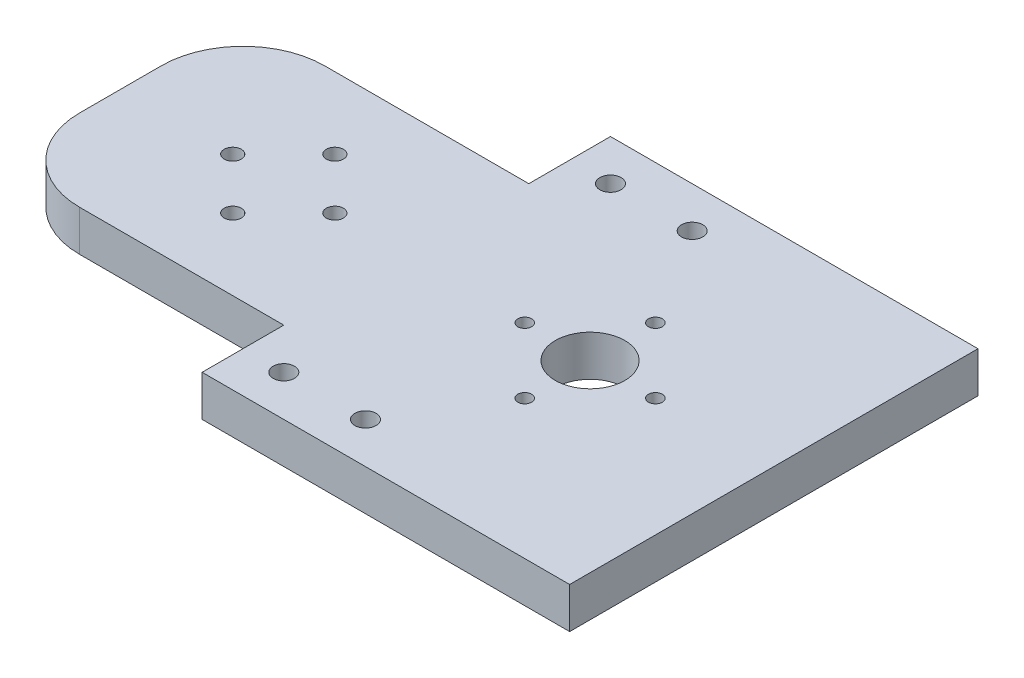
ISO-10303-21;
HEADER;
FILE_DESCRIPTION(('STEP AP214'),'2;1');
FILE_NAME('part.step','',(''),(''),'','','');
FILE_SCHEMA(('AUTOMOTIVE_DESIGN { 1 0 10303 214 1 1 1 1 }'));
ENDSEC;
DATA;
#1=APPLICATION_CONTEXT('core data for automotive mechanical design processes');
#2=APPLICATION_PROTOCOL_DEFINITION('international standard','automotive_design',2000,#1);
#3=PRODUCT_CONTEXT('',#1,'mechanical');
#4=PRODUCT('Part','Part','',(#3));
#5=PRODUCT_RELATED_PRODUCT_CATEGORY('part','',(#4));
#6=PRODUCT_DEFINITION_FORMATION('','',#4);
#7=PRODUCT_DEFINITION_CONTEXT('part definition',#1,'design');
#8=PRODUCT_DEFINITION('design','',#6,#7);
#9=PRODUCT_DEFINITION_SHAPE('','',#8);
#10=(LENGTH_UNIT() NAMED_UNIT(*) SI_UNIT(.MILLI.,.METRE.));
#11=(NAMED_UNIT(*) PLANE_ANGLE_UNIT() SI_UNIT($,.RADIAN.));
#12=(NAMED_UNIT(*) SI_UNIT($,.STERADIAN.) SOLID_ANGLE_UNIT());
#13=UNCERTAINTY_MEASURE_WITH_UNIT(LENGTH_MEASURE(1.E-05),#10,'distance_accuracy_value','');
#14=(GEOMETRIC_REPRESENTATION_CONTEXT(3) GLOBAL_UNCERTAINTY_ASSIGNED_CONTEXT((#13)) GLOBAL_UNIT_ASSIGNED_CONTEXT((#10,
#11,#12)) REPRESENTATION_CONTEXT('',''));
#15=CARTESIAN_POINT('',(0.,0.,0.));
#16=DIRECTION('',(0.,0.,1.));
#17=DIRECTION('',(1.,0.,0.));
#18=AXIS2_PLACEMENT_3D('',#15,#16,#17);
#19=CARTESIAN_POINT('',(-90.,10.,-50.));
#20=DIRECTION('',(0.,0.,1.));
#21=DIRECTION('',(1.,0.,0.));
#22=AXIS2_PLACEMENT_3D('',#19,#20,#21);
#23=PLANE('',#22);
#24=DIRECTION('',(-1.,0.,0.));
#25=VECTOR('',#24,1.);
#26=CARTESIAN_POINT('',(-90.,0.,-50.));
#27=LINE('',#26,#25);
#28=CARTESIAN_POINT('',(0.,0.,-50.));
#29=VERTEX_POINT('',#28);
#30=CARTESIAN_POINT('',(-90.,0.,-50.));
#31=VERTEX_POINT('',#30);
#32=EDGE_CURVE('E1217',#29,#31,#27,.T.);
#33=ORIENTED_EDGE('',*,*,#32,.T.);
#34=DIRECTION('',(0.,-1.,0.));
#35=VECTOR('',#34,1.);
#36=CARTESIAN_POINT('',(-90.,10.,-50.));
#37=LINE('',#36,#35);
#38=CARTESIAN_POINT('',(-90.,10.,-50.));
#39=VERTEX_POINT('',#38);
#40=EDGE_CURVE('E1199',#39,#31,#37,.T.);
#41=ORIENTED_EDGE('',*,*,#40,.F.);
#42=DIRECTION('',(-1.,0.,0.));
#43=VECTOR('',#42,1.);
#44=CARTESIAN_POINT('',(-90.,10.,-50.));
#45=LINE('',#44,#43);
#46=CARTESIAN_POINT('',(0.,10.,-50.));
#47=VERTEX_POINT('',#46);
#48=EDGE_CURVE('E1208',#47,#39,#45,.T.);
#49=ORIENTED_EDGE('',*,*,#48,.F.);
#50=DIRECTION('',(0.,-1.,0.));
#51=VECTOR('',#50,1.);
#52=CARTESIAN_POINT('',(0.,10.,-50.));
#53=LINE('',#52,#51);
#54=EDGE_CURVE('E1294',#47,#29,#53,.T.);
#55=ORIENTED_EDGE('',*,*,#54,.T.);
#56=EDGE_LOOP('',(#33,#41,#49,#55));
#57=FACE_BOUND('',#56,.T.);
#58=ADVANCED_FACE('F1112',(#57),#23,.F.);
#59=CARTESIAN_POINT('',(-90.,10.,-30.));
#60=DIRECTION('',(1.,0.,0.));
#61=DIRECTION('',(0.,0.,-1.));
#62=AXIS2_PLACEMENT_3D('',#59,#60,#61);
#63=PLANE('',#62);
#64=DIRECTION('',(0.,0.,1.));
#65=VECTOR('',#64,1.);
#66=CARTESIAN_POINT('',(-90.,0.,-30.));
#67=LINE('',#66,#65);
#68=CARTESIAN_POINT('',(-90.,0.,-30.));
#69=VERTEX_POINT('',#68);
#70=EDGE_CURVE('E1283',#31,#69,#67,.T.);
#71=ORIENTED_EDGE('',*,*,#70,.T.);
#72=DIRECTION('',(0.,-1.,0.));
#73=VECTOR('',#72,1.);
#74=CARTESIAN_POINT('',(-90.,10.,-30.));
#75=LINE('',#74,#73);
#76=CARTESIAN_POINT('',(-90.,10.,-30.));
#77=VERTEX_POINT('',#76);
#78=EDGE_CURVE('E1202',#77,#69,#75,.T.);
#79=ORIENTED_EDGE('',*,*,#78,.F.);
#80=DIRECTION('',(0.,0.,1.));
#81=VECTOR('',#80,1.);
#82=CARTESIAN_POINT('',(-90.,10.,-30.));
#83=LINE('',#82,#81);
#84=EDGE_CURVE('E1192',#39,#77,#83,.T.);
#85=ORIENTED_EDGE('',*,*,#84,.F.);
#86=ORIENTED_EDGE('',*,*,#40,.T.);
#87=EDGE_LOOP('',(#71,#79,#85,#86));
#88=FACE_BOUND('',#87,.T.);
#89=ADVANCED_FACE('F1200',(#88),#63,.F.);
#90=CARTESIAN_POINT('',(-160.,10.,-30.));
#91=DIRECTION('',(0.,0.,1.));
#92=DIRECTION('',(1.,0.,0.));
#93=AXIS2_PLACEMENT_3D('',#90,#91,#92);
#94=PLANE('',#93);
#95=DIRECTION('',(-1.,0.,0.));
#96=VECTOR('',#95,1.);
#97=CARTESIAN_POINT('',(-160.,0.,-30.));
#98=LINE('',#97,#96);
#99=CARTESIAN_POINT('',(-140.,0.,-30.));
#100=VERTEX_POINT('',#99);
#101=EDGE_CURVE('E1272',#69,#100,#98,.T.);
#102=ORIENTED_EDGE('',*,*,#101,.T.);
#103=DIRECTION('',(0.,-1.,0.));
#104=VECTOR('',#103,1.);
#105=CARTESIAN_POINT('',(-140.,10.,-30.));
#106=LINE('',#105,#104);
#107=CARTESIAN_POINT('',(-140.,10.,-30.));
#108=VERTEX_POINT('',#107);
#109=EDGE_CURVE('E12',#100,#108,#106,.F.);
#110=ORIENTED_EDGE('',*,*,#109,.T.);
#111=DIRECTION('',(-1.,0.,0.));
#112=VECTOR('',#111,1.);
#113=CARTESIAN_POINT('',(-160.,10.,-30.));
#114=LINE('',#113,#112);
#115=EDGE_CURVE('E1204',#77,#108,#114,.T.);
#116=ORIENTED_EDGE('',*,*,#115,.F.);
#117=ORIENTED_EDGE('',*,*,#78,.T.);
#118=EDGE_LOOP('',(#102,#110,#116,#117));
#119=FACE_BOUND('',#118,.T.);
#120=ADVANCED_FACE('F1326',(#119),#94,.F.);
#121=CARTESIAN_POINT('',(-160.,10.,30.));
#122=DIRECTION('',(1.,0.,0.));
#123=DIRECTION('',(0.,0.,-1.));
#124=AXIS2_PLACEMENT_3D('',#121,#122,#123);
#125=PLANE('',#124);
#126=DIRECTION('',(0.,0.,1.));
#127=VECTOR('',#126,1.);
#128=CARTESIAN_POINT('',(-160.,0.,30.));
#129=LINE('',#128,#127);
#130=CARTESIAN_POINT('',(-160.,0.,-10.));
#131=VERTEX_POINT('',#130);
#132=CARTESIAN_POINT('',(-160.,0.,10.));
#133=VERTEX_POINT('',#132);
#134=EDGE_CURVE('E1270',#131,#133,#129,.T.);
#135=ORIENTED_EDGE('',*,*,#134,.T.);
#136=DIRECTION('',(0.,-1.,0.));
#137=VECTOR('',#136,1.);
#138=CARTESIAN_POINT('',(-160.,10.,10.));
#139=LINE('',#138,#137);
#140=CARTESIAN_POINT('',(-160.,10.,10.));
#141=VERTEX_POINT('',#140);
#142=EDGE_CURVE('E1137',#133,#141,#139,.F.);
#143=ORIENTED_EDGE('',*,*,#142,.T.);
#144=DIRECTION('',(0.,0.,1.));
#145=VECTOR('',#144,1.);
#146=CARTESIAN_POINT('',(-160.,10.,30.));
#147=LINE('',#146,#145);
#148=CARTESIAN_POINT('',(-160.,10.,-10.));
#149=VERTEX_POINT('',#148);
#150=EDGE_CURVE('E1251',#149,#141,#147,.T.);
#151=ORIENTED_EDGE('',*,*,#150,.F.);
#152=DIRECTION('',(0.,-1.,0.));
#153=VECTOR('',#152,1.);
#154=CARTESIAN_POINT('',(-160.,10.,-10.));
#155=LINE('',#154,#153);
#156=EDGE_CURVE('E1238',#149,#131,#155,.T.);
#157=ORIENTED_EDGE('',*,*,#156,.T.);
#158=EDGE_LOOP('',(#135,#143,#151,#157));
#159=FACE_BOUND('',#158,.T.);
#160=ADVANCED_FACE('F1275',(#159),#125,.F.);
#161=CARTESIAN_POINT('',(-90.,10.,30.));
#162=DIRECTION('',(0.,0.,-1.));
#163=DIRECTION('',(-1.,0.,0.));
#164=AXIS2_PLACEMENT_3D('',#161,#162,#163);
#165=PLANE('',#164);
#166=DIRECTION('',(1.,0.,0.));
#167=VECTOR('',#166,1.);
#168=CARTESIAN_POINT('',(-90.,10.,30.));
#169=LINE('',#168,#167);
#170=CARTESIAN_POINT('',(-140.,10.,30.));
#171=VERTEX_POINT('',#170);
#172=CARTESIAN_POINT('',(-90.,10.,30.));
#173=VERTEX_POINT('',#172);
#174=EDGE_CURVE('E1254',#171,#173,#169,.T.);
#175=ORIENTED_EDGE('',*,*,#174,.F.);
#176=DIRECTION('',(0.,-1.,0.));
#177=VECTOR('',#176,1.);
#178=CARTESIAN_POINT('',(-140.,10.,30.));
#179=LINE('',#178,#177);
#180=CARTESIAN_POINT('',(-140.,0.,30.));
#181=VERTEX_POINT('',#180);
#182=EDGE_CURVE('E1221',#171,#181,#179,.T.);
#183=ORIENTED_EDGE('',*,*,#182,.T.);
#184=DIRECTION('',(1.,0.,0.));
#185=VECTOR('',#184,1.);
#186=CARTESIAN_POINT('',(-90.,0.,30.));
#187=LINE('',#186,#185);
#188=CARTESIAN_POINT('',(-90.,0.,30.));
#189=VERTEX_POINT('',#188);
#190=EDGE_CURVE('E1273',#181,#189,#187,.T.);
#191=ORIENTED_EDGE('',*,*,#190,.T.);
#192=DIRECTION('',(0.,-1.,0.));
#193=VECTOR('',#192,1.);
#194=CARTESIAN_POINT('',(-90.,10.,30.));
#195=LINE('',#194,#193);
#196=EDGE_CURVE('E1228',#173,#189,#195,.T.);
#197=ORIENTED_EDGE('',*,*,#196,.F.);
#198=EDGE_LOOP('',(#175,#183,#191,#197));
#199=FACE_BOUND('',#198,.T.);
#200=ADVANCED_FACE('F1260',(#199),#165,.F.);
#201=CARTESIAN_POINT('',(-90.,10.,50.));
#202=DIRECTION('',(1.,0.,0.));
#203=DIRECTION('',(0.,0.,-1.));
#204=AXIS2_PLACEMENT_3D('',#201,#202,#203);
#205=PLANE('',#204);
#206=DIRECTION('',(0.,0.,1.));
#207=VECTOR('',#206,1.);
#208=CARTESIAN_POINT('',(-90.,0.,50.));
#209=LINE('',#208,#207);
#210=CARTESIAN_POINT('',(-90.,0.,50.));
#211=VERTEX_POINT('',#210);
#212=EDGE_CURVE('E1279',#189,#211,#209,.T.);
#213=ORIENTED_EDGE('',*,*,#212,.T.);
#214=DIRECTION('',(0.,-1.,0.));
#215=VECTOR('',#214,1.);
#216=CARTESIAN_POINT('',(-90.,10.,50.));
#217=LINE('',#216,#215);
#218=CARTESIAN_POINT('',(-90.,10.,50.));
#219=VERTEX_POINT('',#218);
#220=EDGE_CURVE('E1296',#219,#211,#217,.T.);
#221=ORIENTED_EDGE('',*,*,#220,.F.);
#222=DIRECTION('',(0.,0.,1.));
#223=VECTOR('',#222,1.);
#224=CARTESIAN_POINT('',(-90.,10.,50.));
#225=LINE('',#224,#223);
#226=EDGE_CURVE('E1261',#173,#219,#225,.T.);
#227=ORIENTED_EDGE('',*,*,#226,.F.);
#228=ORIENTED_EDGE('',*,*,#196,.T.);
#229=EDGE_LOOP('',(#213,#221,#227,#228));
#230=FACE_BOUND('',#229,.T.);
#231=ADVANCED_FACE('F1302',(#230),#205,.F.);
#232=CARTESIAN_POINT('',(0.,10.,50.));
#233=DIRECTION('',(0.,0.,-1.));
#234=DIRECTION('',(-1.,0.,0.));
#235=AXIS2_PLACEMENT_3D('',#232,#233,#234);
#236=PLANE('',#235);
#237=DIRECTION('',(1.,0.,0.));
#238=VECTOR('',#237,1.);
#239=CARTESIAN_POINT('',(0.,0.,50.));
#240=LINE('',#239,#238);
#241=CARTESIAN_POINT('',(0.,0.,50.));
#242=VERTEX_POINT('',#241);
#243=EDGE_CURVE('E1287',#211,#242,#240,.T.);
#244=ORIENTED_EDGE('',*,*,#243,.T.);
#245=DIRECTION('',(0.,-1.,0.));
#246=VECTOR('',#245,1.);
#247=CARTESIAN_POINT('',(0.,10.,50.));
#248=LINE('',#247,#246);
#249=CARTESIAN_POINT('',(0.,10.,50.));
#250=VERTEX_POINT('',#249);
#251=EDGE_CURVE('E1293',#250,#242,#248,.T.);
#252=ORIENTED_EDGE('',*,*,#251,.F.);
#253=DIRECTION('',(1.,0.,0.));
#254=VECTOR('',#253,1.);
#255=CARTESIAN_POINT('',(0.,10.,50.));
#256=LINE('',#255,#254);
#257=EDGE_CURVE('E1317',#219,#250,#256,.T.);
#258=ORIENTED_EDGE('',*,*,#257,.F.);
#259=ORIENTED_EDGE('',*,*,#220,.T.);
#260=EDGE_LOOP('',(#244,#252,#258,#259));
#261=FACE_BOUND('',#260,.T.);
#262=ADVANCED_FACE('F1312',(#261),#236,.F.);
#263=CARTESIAN_POINT('',(0.,10.,-50.));
#264=DIRECTION('',(-1.,0.,0.));
#265=DIRECTION('',(0.,0.,1.));
#266=AXIS2_PLACEMENT_3D('',#263,#264,#265);
#267=PLANE('',#266);
#268=DIRECTION('',(0.,0.,-1.));
#269=VECTOR('',#268,1.);
#270=CARTESIAN_POINT('',(0.,0.,-50.));
#271=LINE('',#270,#269);
#272=EDGE_CURVE('E1216',#242,#29,#271,.T.);
#273=ORIENTED_EDGE('',*,*,#272,.T.);
#274=ORIENTED_EDGE('',*,*,#54,.F.);
#275=DIRECTION('',(0.,0.,-1.));
#276=VECTOR('',#275,1.);
#277=CARTESIAN_POINT('',(0.,10.,-50.));
#278=LINE('',#277,#276);
#279=EDGE_CURVE('E1211',#250,#47,#278,.T.);
#280=ORIENTED_EDGE('',*,*,#279,.F.);
#281=ORIENTED_EDGE('',*,*,#251,.T.);
#282=EDGE_LOOP('',(#273,#274,#280,#281));
#283=FACE_BOUND('',#282,.T.);
#284=ADVANCED_FACE('F1314',(#283),#267,.F.);
#285=CARTESIAN_POINT('',(0.,10.,0.));
#286=DIRECTION('',(0.,-1.,0.));
#287=DIRECTION('',(0.,0.,-1.));
#288=AXIS2_PLACEMENT_3D('',#285,#286,#287);
#289=PLANE('',#288);
#290=CARTESIAN_POINT('',(-120.,10.,12.5));
#291=DIRECTION('',(0.,-1.,0.));
#292=DIRECTION('',(0.,0.,-1.));
#293=AXIS2_PLACEMENT_3D('',#290,#291,#292);
#294=CIRCLE('',#293,2.1);
#295=CARTESIAN_POINT('',(-120.,10.,10.4));
#296=VERTEX_POINT('',#295);
#297=EDGE_CURVE('E1472',#296,#296,#294,.T.);
#298=ORIENTED_EDGE('',*,*,#297,.T.);
#299=EDGE_LOOP('',(#298));
#300=FACE_BOUND('',#299,.T.);
#301=CARTESIAN_POINT('',(-132.5,10.,0.));
#302=DIRECTION('',(0.,-1.,0.));
#303=DIRECTION('',(0.,0.,-1.));
#304=AXIS2_PLACEMENT_3D('',#301,#302,#303);
#305=CIRCLE('',#304,2.09999999999999);
#306=CARTESIAN_POINT('',(-132.5,10.,-2.09999999999999));
#307=VERTEX_POINT('',#306);
#308=EDGE_CURVE('E1363',#307,#307,#305,.T.);
#309=ORIENTED_EDGE('',*,*,#308,.T.);
#310=EDGE_LOOP('',(#309));
#311=FACE_BOUND('',#310,.T.);
#312=CARTESIAN_POINT('',(-120.,10.,-12.5));
#313=DIRECTION('',(0.,-1.,0.));
#314=DIRECTION('',(0.,0.,-1.));
#315=AXIS2_PLACEMENT_3D('',#312,#313,#314);
#316=CIRCLE('',#315,2.1);
#317=CARTESIAN_POINT('',(-120.,10.,-14.6));
#318=VERTEX_POINT('',#317);
#319=EDGE_CURVE('E1369',#318,#318,#316,.T.);
#320=ORIENTED_EDGE('',*,*,#319,.T.);
#321=EDGE_LOOP('',(#320));
#322=FACE_BOUND('',#321,.T.);
#323=CARTESIAN_POINT('',(-107.5,10.,0.));
#324=DIRECTION('',(0.,-1.,0.));
#325=DIRECTION('',(0.,0.,-1.));
#326=AXIS2_PLACEMENT_3D('',#323,#324,#325);
#327=CIRCLE('',#326,2.1);
#328=CARTESIAN_POINT('',(-107.5,10.,-2.1));
#329=VERTEX_POINT('',#328);
#330=EDGE_CURVE('E1493',#329,#329,#327,.T.);
#331=ORIENTED_EDGE('',*,*,#330,.T.);
#332=EDGE_LOOP('',(#331));
#333=FACE_BOUND('',#332,.T.);
#334=CARTESIAN_POINT('',(-44.9999999999922,10.,16.0000000000004));
#335=DIRECTION('',(0.,-1.,0.));
#336=DIRECTION('',(0.,0.,-1.));
#337=AXIS2_PLACEMENT_3D('',#334,#335,#336);
#338=CIRCLE('',#337,1.7);
#339=CARTESIAN_POINT('',(-44.9999999999922,10.,14.3000000000004));
#340=VERTEX_POINT('',#339);
#341=EDGE_CURVE('E1355',#340,#340,#338,.T.);
#342=ORIENTED_EDGE('',*,*,#341,.T.);
#343=EDGE_LOOP('',(#342));
#344=FACE_BOUND('',#343,.T.);
#345=CARTESIAN_POINT('',(-44.9999999999922,10.,-15.9999999999996));
#346=DIRECTION('',(0.,-1.,0.));
#347=DIRECTION('',(0.,0.,-1.));
#348=AXIS2_PLACEMENT_3D('',#345,#346,#347);
#349=CIRCLE('',#348,1.7);
#350=CARTESIAN_POINT('',(-44.9999999999922,10.,-17.6999999999996));
#351=VERTEX_POINT('',#350);
#352=EDGE_CURVE('E1344',#351,#351,#349,.T.);
#353=ORIENTED_EDGE('',*,*,#352,.T.);
#354=EDGE_LOOP('',(#353));
#355=FACE_BOUND('',#354,.T.);
#356=CARTESIAN_POINT('',(-28.9999999999922,10.,0.));
#357=DIRECTION('',(0.,-1.,0.));
#358=DIRECTION('',(0.,0.,-1.));
#359=AXIS2_PLACEMENT_3D('',#356,#357,#358);
#360=CIRCLE('',#359,1.7);
#361=CARTESIAN_POINT('',(-28.9999999999922,10.,-1.7));
#362=VERTEX_POINT('',#361);
#363=EDGE_CURVE('E1336',#362,#362,#360,.T.);
#364=ORIENTED_EDGE('',*,*,#363,.T.);
#365=EDGE_LOOP('',(#364));
#366=FACE_BOUND('',#365,.T.);
#367=CARTESIAN_POINT('',(-60.9999999999922,10.,0.));
#368=DIRECTION('',(0.,-1.,0.));
#369=DIRECTION('',(0.,0.,1.));
#370=AXIS2_PLACEMENT_3D('',#367,#368,#369);
#371=CIRCLE('',#370,1.7);
#372=CARTESIAN_POINT('',(-60.9999999999922,10.,1.7));
#373=VERTEX_POINT('',#372);
#374=EDGE_CURVE('E1481',#373,#373,#371,.T.);
#375=ORIENTED_EDGE('',*,*,#374,.T.);
#376=EDGE_LOOP('',(#375));
#377=FACE_BOUND('',#376,.T.);
#378=CARTESIAN_POINT('',(-44.9999999999922,10.,3.84349670146111E-13));
#379=DIRECTION('',(0.,-1.,0.));
#380=DIRECTION('',(0.,0.,-1.));
#381=AXIS2_PLACEMENT_3D('',#378,#379,#380);
#382=CIRCLE('',#381,8.49999999999221);
#383=CARTESIAN_POINT('',(-44.9999999999922,10.,-8.49999999999183));
#384=VERTEX_POINT('',#383);
#385=EDGE_CURVE('E1351',#384,#384,#382,.T.);
#386=ORIENTED_EDGE('',*,*,#385,.T.);
#387=EDGE_LOOP('',(#386));
#388=FACE_BOUND('',#387,.T.);
#389=CARTESIAN_POINT('',(-60.,10.,-40.));
#390=DIRECTION('',(0.,1.,0.));
#391=DIRECTION('',(0.,0.,1.));
#392=AXIS2_PLACEMENT_3D('',#389,#390,#391);
#393=CIRCLE('',#392,2.6);
#394=CARTESIAN_POINT('',(-60.,10.,-37.4));
#395=VERTEX_POINT('',#394);
#396=EDGE_CURVE('E1385',#395,#395,#393,.T.);
#397=ORIENTED_EDGE('',*,*,#396,.F.);
#398=EDGE_LOOP('',(#397));
#399=FACE_BOUND('',#398,.T.);
#400=CARTESIAN_POINT('',(-80.,10.,-40.));
#401=DIRECTION('',(0.,1.,0.));
#402=DIRECTION('',(0.,0.,1.));
#403=AXIS2_PLACEMENT_3D('',#400,#401,#402);
#404=CIRCLE('',#403,2.6);
#405=CARTESIAN_POINT('',(-80.,10.,-37.4));
#406=VERTEX_POINT('',#405);
#407=EDGE_CURVE('E1375',#406,#406,#404,.T.);
#408=ORIENTED_EDGE('',*,*,#407,.F.);
#409=EDGE_LOOP('',(#408));
#410=FACE_BOUND('',#409,.T.);
#411=CARTESIAN_POINT('',(-80.,10.,40.));
#412=DIRECTION('',(0.,1.,0.));
#413=DIRECTION('',(0.,0.,1.));
#414=AXIS2_PLACEMENT_3D('',#411,#412,#413);
#415=CIRCLE('',#414,2.6);
#416=CARTESIAN_POINT('',(-80.,10.,42.6));
#417=VERTEX_POINT('',#416);
#418=EDGE_CURVE('E1359',#417,#417,#415,.T.);
#419=ORIENTED_EDGE('',*,*,#418,.F.);
#420=EDGE_LOOP('',(#419));
#421=FACE_BOUND('',#420,.T.);
#422=CARTESIAN_POINT('',(-60.,10.,40.));
#423=DIRECTION('',(0.,1.,0.));
#424=DIRECTION('',(0.,0.,1.));
#425=AXIS2_PLACEMENT_3D('',#422,#423,#424);
#426=CIRCLE('',#425,2.6);
#427=CARTESIAN_POINT('',(-60.,10.,42.6));
#428=VERTEX_POINT('',#427);
#429=EDGE_CURVE('E1354',#428,#428,#426,.T.);
#430=ORIENTED_EDGE('',*,*,#429,.F.);
#431=EDGE_LOOP('',(#430));
#432=FACE_BOUND('',#431,.T.);
#433=ORIENTED_EDGE('',*,*,#150,.T.);
#434=CARTESIAN_POINT('',(-140.,10.,10.));
#435=DIRECTION('',(0.,-1.,0.));
#436=DIRECTION('',(0.,0.,-1.));
#437=AXIS2_PLACEMENT_3D('',#434,#435,#436);
#438=CIRCLE('',#437,20.);
#439=EDGE_CURVE('E1121',#141,#171,#438,.F.);
#440=ORIENTED_EDGE('',*,*,#439,.T.);
#441=ORIENTED_EDGE('',*,*,#174,.T.);
#442=ORIENTED_EDGE('',*,*,#226,.T.);
#443=ORIENTED_EDGE('',*,*,#257,.T.);
#444=ORIENTED_EDGE('',*,*,#279,.T.);
#445=ORIENTED_EDGE('',*,*,#48,.T.);
#446=ORIENTED_EDGE('',*,*,#84,.T.);
#447=ORIENTED_EDGE('',*,*,#115,.T.);
#448=CARTESIAN_POINT('',(-140.,10.,-10.));
#449=DIRECTION('',(0.,-1.,0.));
#450=DIRECTION('',(0.,0.,-1.));
#451=AXIS2_PLACEMENT_3D('',#448,#449,#450);
#452=CIRCLE('',#451,20.);
#453=EDGE_CURVE('E1242',#108,#149,#452,.F.);
#454=ORIENTED_EDGE('',*,*,#453,.T.);
#455=EDGE_LOOP('',(#433,#440,#441,#442,#443,#444,#445,#446,#447,#454));
#456=FACE_BOUND('',#455,.T.);
#457=ADVANCED_FACE('F1209',(#300,#311,#322,#333,#344,#355,#366,#377,#388,#399,#410,#421,#432,
#456),#289,.F.);
#458=CARTESIAN_POINT('',(0.,0.,0.));
#459=DIRECTION('',(0.,-1.,0.));
#460=DIRECTION('',(0.,0.,-1.));
#461=AXIS2_PLACEMENT_3D('',#458,#459,#460);
#462=PLANE('',#461);
#463=CARTESIAN_POINT('',(-120.,0.,12.5));
#464=DIRECTION('',(0.,-1.,0.));
#465=DIRECTION('',(0.,0.,-1.));
#466=AXIS2_PLACEMENT_3D('',#463,#464,#465);
#467=CIRCLE('',#466,2.1);
#468=CARTESIAN_POINT('',(-120.,0.,10.4));
#469=VERTEX_POINT('',#468);
#470=EDGE_CURVE('E1480',#469,#469,#467,.T.);
#471=ORIENTED_EDGE('',*,*,#470,.F.);
#472=EDGE_LOOP('',(#471));
#473=FACE_BOUND('',#472,.T.);
#474=CARTESIAN_POINT('',(-132.5,0.,0.));
#475=DIRECTION('',(0.,-1.,0.));
#476=DIRECTION('',(0.,0.,-1.));
#477=AXIS2_PLACEMENT_3D('',#474,#475,#476);
#478=CIRCLE('',#477,2.09999999999999);
#479=CARTESIAN_POINT('',(-132.5,0.,-2.09999999999999));
#480=VERTEX_POINT('',#479);
#481=EDGE_CURVE('E1478',#480,#480,#478,.T.);
#482=ORIENTED_EDGE('',*,*,#481,.F.);
#483=EDGE_LOOP('',(#482));
#484=FACE_BOUND('',#483,.T.);
#485=CARTESIAN_POINT('',(-120.,0.,-12.5));
#486=DIRECTION('',(0.,-1.,0.));
#487=DIRECTION('',(0.,0.,-1.));
#488=AXIS2_PLACEMENT_3D('',#485,#486,#487);
#489=CIRCLE('',#488,2.1);
#490=CARTESIAN_POINT('',(-120.,0.,-14.6));
#491=VERTEX_POINT('',#490);
#492=EDGE_CURVE('E1365',#491,#491,#489,.T.);
#493=ORIENTED_EDGE('',*,*,#492,.F.);
#494=EDGE_LOOP('',(#493));
#495=FACE_BOUND('',#494,.T.);
#496=CARTESIAN_POINT('',(-107.5,0.,0.));
#497=DIRECTION('',(0.,-1.,0.));
#498=DIRECTION('',(0.,0.,-1.));
#499=AXIS2_PLACEMENT_3D('',#496,#497,#498);
#500=CIRCLE('',#499,2.1);
#501=CARTESIAN_POINT('',(-107.5,0.,-2.1));
#502=VERTEX_POINT('',#501);
#503=EDGE_CURVE('E1492',#502,#502,#500,.T.);
#504=ORIENTED_EDGE('',*,*,#503,.F.);
#505=EDGE_LOOP('',(#504));
#506=FACE_BOUND('',#505,.T.);
#507=CARTESIAN_POINT('',(-44.9999999999922,0.,16.0000000000004));
#508=DIRECTION('',(0.,-1.,0.));
#509=DIRECTION('',(0.,0.,-1.));
#510=AXIS2_PLACEMENT_3D('',#507,#508,#509);
#511=CIRCLE('',#510,1.7);
#512=CARTESIAN_POINT('',(-44.9999999999922,0.,14.3000000000004));
#513=VERTEX_POINT('',#512);
#514=EDGE_CURVE('E1503',#513,#513,#511,.T.);
#515=ORIENTED_EDGE('',*,*,#514,.F.);
#516=EDGE_LOOP('',(#515));
#517=FACE_BOUND('',#516,.T.);
#518=CARTESIAN_POINT('',(-44.9999999999922,0.,-15.9999999999996));
#519=DIRECTION('',(0.,-1.,0.));
#520=DIRECTION('',(0.,0.,-1.));
#521=AXIS2_PLACEMENT_3D('',#518,#519,#520);
#522=CIRCLE('',#521,1.7);
#523=CARTESIAN_POINT('',(-44.9999999999922,0.,-17.6999999999996));
#524=VERTEX_POINT('',#523);
#525=EDGE_CURVE('E1504',#524,#524,#522,.T.);
#526=ORIENTED_EDGE('',*,*,#525,.F.);
#527=EDGE_LOOP('',(#526));
#528=FACE_BOUND('',#527,.T.);
#529=CARTESIAN_POINT('',(-28.9999999999922,0.,0.));
#530=DIRECTION('',(0.,-1.,0.));
#531=DIRECTION('',(0.,0.,-1.));
#532=AXIS2_PLACEMENT_3D('',#529,#530,#531);
#533=CIRCLE('',#532,1.7);
#534=CARTESIAN_POINT('',(-28.9999999999922,0.,-1.7));
#535=VERTEX_POINT('',#534);
#536=EDGE_CURVE('E1341',#535,#535,#533,.T.);
#537=ORIENTED_EDGE('',*,*,#536,.F.);
#538=EDGE_LOOP('',(#537));
#539=FACE_BOUND('',#538,.T.);
#540=CARTESIAN_POINT('',(-60.9999999999922,0.,0.));
#541=DIRECTION('',(0.,-1.,0.));
#542=DIRECTION('',(0.,0.,1.));
#543=AXIS2_PLACEMENT_3D('',#540,#541,#542);
#544=CIRCLE('',#543,1.7);
#545=CARTESIAN_POINT('',(-60.9999999999922,0.,1.7));
#546=VERTEX_POINT('',#545);
#547=EDGE_CURVE('E1345',#546,#546,#544,.T.);
#548=ORIENTED_EDGE('',*,*,#547,.F.);
#549=EDGE_LOOP('',(#548));
#550=FACE_BOUND('',#549,.T.);
#551=CARTESIAN_POINT('',(-44.9999999999922,0.,3.84349670146111E-13));
#552=DIRECTION('',(0.,-1.,0.));
#553=DIRECTION('',(0.,0.,-1.));
#554=AXIS2_PLACEMENT_3D('',#551,#552,#553);
#555=CIRCLE('',#554,8.49999999999221);
#556=CARTESIAN_POINT('',(-44.9999999999922,0.,-8.49999999999183));
#557=VERTEX_POINT('',#556);
#558=EDGE_CURVE('E1348',#557,#557,#555,.T.);
#559=ORIENTED_EDGE('',*,*,#558,.F.);
#560=EDGE_LOOP('',(#559));
#561=FACE_BOUND('',#560,.T.);
#562=CARTESIAN_POINT('',(-60.,0.,-40.));
#563=DIRECTION('',(0.,1.,0.));
#564=DIRECTION('',(0.,0.,1.));
#565=AXIS2_PLACEMENT_3D('',#562,#563,#564);
#566=CIRCLE('',#565,2.6);
#567=CARTESIAN_POINT('',(-60.,0.,-37.4));
#568=VERTEX_POINT('',#567);
#569=EDGE_CURVE('E1367',#568,#568,#566,.T.);
#570=ORIENTED_EDGE('',*,*,#569,.T.);
#571=EDGE_LOOP('',(#570));
#572=FACE_BOUND('',#571,.T.);
#573=CARTESIAN_POINT('',(-80.,0.,-40.));
#574=DIRECTION('',(0.,1.,0.));
#575=DIRECTION('',(0.,0.,1.));
#576=AXIS2_PLACEMENT_3D('',#573,#574,#575);
#577=CIRCLE('',#576,2.6);
#578=CARTESIAN_POINT('',(-80.,0.,-37.4));
#579=VERTEX_POINT('',#578);
#580=EDGE_CURVE('E1374',#579,#579,#577,.T.);
#581=ORIENTED_EDGE('',*,*,#580,.T.);
#582=EDGE_LOOP('',(#581));
#583=FACE_BOUND('',#582,.T.);
#584=CARTESIAN_POINT('',(-80.,0.,40.));
#585=DIRECTION('',(0.,1.,0.));
#586=DIRECTION('',(0.,0.,1.));
#587=AXIS2_PLACEMENT_3D('',#584,#585,#586);
#588=CIRCLE('',#587,2.6);
#589=CARTESIAN_POINT('',(-80.,0.,42.6));
#590=VERTEX_POINT('',#589);
#591=EDGE_CURVE('E1362',#590,#590,#588,.T.);
#592=ORIENTED_EDGE('',*,*,#591,.T.);
#593=EDGE_LOOP('',(#592));
#594=FACE_BOUND('',#593,.T.);
#595=CARTESIAN_POINT('',(-60.,0.,40.));
#596=DIRECTION('',(0.,1.,0.));
#597=DIRECTION('',(0.,0.,1.));
#598=AXIS2_PLACEMENT_3D('',#595,#596,#597);
#599=CIRCLE('',#598,2.6);
#600=CARTESIAN_POINT('',(-60.,0.,42.6));
#601=VERTEX_POINT('',#600);
#602=EDGE_CURVE('E1323',#601,#601,#599,.T.);
#603=ORIENTED_EDGE('',*,*,#602,.T.);
#604=EDGE_LOOP('',(#603));
#605=FACE_BOUND('',#604,.T.);
#606=ORIENTED_EDGE('',*,*,#190,.F.);
#607=CARTESIAN_POINT('',(-140.,0.,10.));
#608=DIRECTION('',(0.,-1.,0.));
#609=DIRECTION('',(0.,0.,-1.));
#610=AXIS2_PLACEMENT_3D('',#607,#608,#609);
#611=CIRCLE('',#610,20.);
#612=EDGE_CURVE('E1239',#181,#133,#611,.T.);
#613=ORIENTED_EDGE('',*,*,#612,.T.);
#614=ORIENTED_EDGE('',*,*,#134,.F.);
#615=CARTESIAN_POINT('',(-140.,0.,-10.));
#616=DIRECTION('',(0.,-1.,0.));
#617=DIRECTION('',(0.,0.,-1.));
#618=AXIS2_PLACEMENT_3D('',#615,#616,#617);
#619=CIRCLE('',#618,20.);
#620=EDGE_CURVE('E1230',#131,#100,#619,.T.);
#621=ORIENTED_EDGE('',*,*,#620,.T.);
#622=ORIENTED_EDGE('',*,*,#101,.F.);
#623=ORIENTED_EDGE('',*,*,#70,.F.);
#624=ORIENTED_EDGE('',*,*,#32,.F.);
#625=ORIENTED_EDGE('',*,*,#272,.F.);
#626=ORIENTED_EDGE('',*,*,#243,.F.);
#627=ORIENTED_EDGE('',*,*,#212,.F.);
#628=EDGE_LOOP('',(#606,#613,#614,#621,#622,#623,#624,#625,#626,#627));
#629=FACE_BOUND('',#628,.T.);
#630=ADVANCED_FACE('F1266',(#473,#484,#495,#506,#517,#528,#539,#550,#561,#572,#583,#594,#605,
#629),#462,.T.);
#631=CARTESIAN_POINT('',(-140.,10.,10.));
#632=DIRECTION('',(0.,-1.,0.));
#633=DIRECTION('',(0.,0.,-1.));
#634=AXIS2_PLACEMENT_3D('',#631,#632,#633);
#635=CYLINDRICAL_SURFACE('',#634,20.);
#636=ORIENTED_EDGE('',*,*,#439,.F.);
#637=ORIENTED_EDGE('',*,*,#142,.F.);
#638=ORIENTED_EDGE('',*,*,#612,.F.);
#639=ORIENTED_EDGE('',*,*,#182,.F.);
#640=EDGE_LOOP('',(#636,#637,#638,#639));
#641=FACE_BOUND('',#640,.T.);
#642=ADVANCED_FACE('F1262',(#641),#635,.T.);
#643=CARTESIAN_POINT('',(-140.,10.,-10.));
#644=DIRECTION('',(0.,-1.,0.));
#645=DIRECTION('',(0.,0.,-1.));
#646=AXIS2_PLACEMENT_3D('',#643,#644,#645);
#647=CYLINDRICAL_SURFACE('',#646,20.);
#648=ORIENTED_EDGE('',*,*,#453,.F.);
#649=ORIENTED_EDGE('',*,*,#109,.F.);
#650=ORIENTED_EDGE('',*,*,#620,.F.);
#651=ORIENTED_EDGE('',*,*,#156,.F.);
#652=EDGE_LOOP('',(#648,#649,#650,#651));
#653=FACE_BOUND('',#652,.T.);
#654=ADVANCED_FACE('F1120',(#653),#647,.T.);
#655=CARTESIAN_POINT('',(-60.,0.,40.));
#656=DIRECTION('',(0.,1.,0.));
#657=DIRECTION('',(0.,0.,1.));
#658=AXIS2_PLACEMENT_3D('',#655,#656,#657);
#659=CYLINDRICAL_SURFACE('',#658,2.6);
#660=ORIENTED_EDGE('',*,*,#602,.F.);
#661=EDGE_LOOP('',(#660));
#662=FACE_BOUND('',#661,.T.);
#663=ORIENTED_EDGE('',*,*,#429,.T.);
#664=EDGE_LOOP('',(#663));
#665=FACE_BOUND('',#664,.T.);
#666=ADVANCED_FACE('F1392',(#662,#665),#659,.F.);
#667=CARTESIAN_POINT('',(-80.,0.,40.));
#668=DIRECTION('',(0.,1.,0.));
#669=DIRECTION('',(0.,0.,1.));
#670=AXIS2_PLACEMENT_3D('',#667,#668,#669);
#671=CYLINDRICAL_SURFACE('',#670,2.6);
#672=ORIENTED_EDGE('',*,*,#591,.F.);
#673=EDGE_LOOP('',(#672));
#674=FACE_BOUND('',#673,.T.);
#675=ORIENTED_EDGE('',*,*,#418,.T.);
#676=EDGE_LOOP('',(#675));
#677=FACE_BOUND('',#676,.T.);
#678=ADVANCED_FACE('F1419',(#674,#677),#671,.F.);
#679=CARTESIAN_POINT('',(-80.,0.,-40.));
#680=DIRECTION('',(0.,1.,0.));
#681=DIRECTION('',(0.,0.,1.));
#682=AXIS2_PLACEMENT_3D('',#679,#680,#681);
#683=CYLINDRICAL_SURFACE('',#682,2.6);
#684=ORIENTED_EDGE('',*,*,#580,.F.);
#685=EDGE_LOOP('',(#684));
#686=FACE_BOUND('',#685,.T.);
#687=ORIENTED_EDGE('',*,*,#407,.T.);
#688=EDGE_LOOP('',(#687));
#689=FACE_BOUND('',#688,.T.);
#690=ADVANCED_FACE('F1421',(#686,#689),#683,.F.);
#691=CARTESIAN_POINT('',(-60.,0.,-40.));
#692=DIRECTION('',(0.,1.,0.));
#693=DIRECTION('',(0.,0.,1.));
#694=AXIS2_PLACEMENT_3D('',#691,#692,#693);
#695=CYLINDRICAL_SURFACE('',#694,2.6);
#696=ORIENTED_EDGE('',*,*,#569,.F.);
#697=EDGE_LOOP('',(#696));
#698=FACE_BOUND('',#697,.T.);
#699=ORIENTED_EDGE('',*,*,#396,.T.);
#700=EDGE_LOOP('',(#699));
#701=FACE_BOUND('',#700,.T.);
#702=ADVANCED_FACE('F1426',(#698,#701),#695,.F.);
#703=CARTESIAN_POINT('',(-44.9999999999922,10.,3.84349670146111E-13));
#704=DIRECTION('',(0.,-1.,0.));
#705=DIRECTION('',(0.,0.,-1.));
#706=AXIS2_PLACEMENT_3D('',#703,#704,#705);
#707=CYLINDRICAL_SURFACE('',#706,8.49999999999221);
#708=ORIENTED_EDGE('',*,*,#385,.F.);
#709=EDGE_LOOP('',(#708));
#710=FACE_BOUND('',#709,.T.);
#711=ORIENTED_EDGE('',*,*,#558,.T.);
#712=EDGE_LOOP('',(#711));
#713=FACE_BOUND('',#712,.T.);
#714=ADVANCED_FACE('F1431',(#710,#713),#707,.F.);
#715=CARTESIAN_POINT('',(-60.9999999999922,10.,0.));
#716=DIRECTION('',(0.,-1.,0.));
#717=DIRECTION('',(0.,0.,-1.));
#718=AXIS2_PLACEMENT_3D('',#715,#716,#717);
#719=CYLINDRICAL_SURFACE('',#718,1.7);
#720=ORIENTED_EDGE('',*,*,#374,.F.);
#721=EDGE_LOOP('',(#720));
#722=FACE_BOUND('',#721,.T.);
#723=ORIENTED_EDGE('',*,*,#547,.T.);
#724=EDGE_LOOP('',(#723));
#725=FACE_BOUND('',#724,.T.);
#726=ADVANCED_FACE('F1439',(#722,#725),#719,.F.);
#727=CARTESIAN_POINT('',(-28.9999999999922,10.,0.));
#728=DIRECTION('',(0.,-1.,0.));
#729=DIRECTION('',(0.,0.,-1.));
#730=AXIS2_PLACEMENT_3D('',#727,#728,#729);
#731=CYLINDRICAL_SURFACE('',#730,1.7);
#732=ORIENTED_EDGE('',*,*,#363,.F.);
#733=EDGE_LOOP('',(#732));
#734=FACE_BOUND('',#733,.T.);
#735=ORIENTED_EDGE('',*,*,#536,.T.);
#736=EDGE_LOOP('',(#735));
#737=FACE_BOUND('',#736,.T.);
#738=ADVANCED_FACE('F1441',(#734,#737),#731,.F.);
#739=CARTESIAN_POINT('',(-44.9999999999922,10.,-15.9999999999996));
#740=DIRECTION('',(0.,-1.,0.));
#741=DIRECTION('',(0.,0.,-1.));
#742=AXIS2_PLACEMENT_3D('',#739,#740,#741);
#743=CYLINDRICAL_SURFACE('',#742,1.7);
#744=ORIENTED_EDGE('',*,*,#352,.F.);
#745=EDGE_LOOP('',(#744));
#746=FACE_BOUND('',#745,.T.);
#747=ORIENTED_EDGE('',*,*,#525,.T.);
#748=EDGE_LOOP('',(#747));
#749=FACE_BOUND('',#748,.T.);
#750=ADVANCED_FACE('F1449',(#746,#749),#743,.F.);
#751=CARTESIAN_POINT('',(-44.9999999999922,10.,16.0000000000004));
#752=DIRECTION('',(0.,-1.,0.));
#753=DIRECTION('',(0.,0.,-1.));
#754=AXIS2_PLACEMENT_3D('',#751,#752,#753);
#755=CYLINDRICAL_SURFACE('',#754,1.7);
#756=ORIENTED_EDGE('',*,*,#341,.F.);
#757=EDGE_LOOP('',(#756));
#758=FACE_BOUND('',#757,.T.);
#759=ORIENTED_EDGE('',*,*,#514,.T.);
#760=EDGE_LOOP('',(#759));
#761=FACE_BOUND('',#760,.T.);
#762=ADVANCED_FACE('F1454',(#758,#761),#755,.F.);
#763=CARTESIAN_POINT('',(-107.5,10.,0.));
#764=DIRECTION('',(0.,-1.,0.));
#765=DIRECTION('',(0.,0.,-1.));
#766=AXIS2_PLACEMENT_3D('',#763,#764,#765);
#767=CYLINDRICAL_SURFACE('',#766,2.1);
#768=ORIENTED_EDGE('',*,*,#330,.F.);
#769=EDGE_LOOP('',(#768));
#770=FACE_BOUND('',#769,.T.);
#771=ORIENTED_EDGE('',*,*,#503,.T.);
#772=EDGE_LOOP('',(#771));
#773=FACE_BOUND('',#772,.T.);
#774=ADVANCED_FACE('F1452',(#770,#773),#767,.F.);
#775=CARTESIAN_POINT('',(-120.,10.,-12.5));
#776=DIRECTION('',(0.,-1.,0.));
#777=DIRECTION('',(0.,0.,-1.));
#778=AXIS2_PLACEMENT_3D('',#775,#776,#777);
#779=CYLINDRICAL_SURFACE('',#778,2.1);
#780=ORIENTED_EDGE('',*,*,#319,.F.);
#781=EDGE_LOOP('',(#780));
#782=FACE_BOUND('',#781,.T.);
#783=ORIENTED_EDGE('',*,*,#492,.T.);
#784=EDGE_LOOP('',(#783));
#785=FACE_BOUND('',#784,.T.);
#786=ADVANCED_FACE('F1459',(#782,#785),#779,.F.);
#787=CARTESIAN_POINT('',(-132.5,10.,0.));
#788=DIRECTION('',(0.,-1.,0.));
#789=DIRECTION('',(0.,0.,-1.));
#790=AXIS2_PLACEMENT_3D('',#787,#788,#789);
#791=CYLINDRICAL_SURFACE('',#790,2.09999999999999);
#792=ORIENTED_EDGE('',*,*,#308,.F.);
#793=EDGE_LOOP('',(#792));
#794=FACE_BOUND('',#793,.T.);
#795=ORIENTED_EDGE('',*,*,#481,.T.);
#796=EDGE_LOOP('',(#795));
#797=FACE_BOUND('',#796,.T.);
#798=ADVANCED_FACE('F1461',(#794,#797),#791,.F.);
#799=CARTESIAN_POINT('',(-120.,10.,12.5));
#800=DIRECTION('',(0.,-1.,0.));
#801=DIRECTION('',(0.,0.,-1.));
#802=AXIS2_PLACEMENT_3D('',#799,#800,#801);
#803=CYLINDRICAL_SURFACE('',#802,2.1);
#804=ORIENTED_EDGE('',*,*,#297,.F.);
#805=EDGE_LOOP('',(#804));
#806=FACE_BOUND('',#805,.T.);
#807=ORIENTED_EDGE('',*,*,#470,.T.);
#808=EDGE_LOOP('',(#807));
#809=FACE_BOUND('',#808,.T.);
#810=ADVANCED_FACE('F1470',(#806,#809),#803,.F.);
#811=CLOSED_SHELL('',(#58,#89,#120,#160,#200,#231,#262,#284,#457,#630,#642,#654,#666,#678,#690,
#702,#714,#726,#738,#750,#762,#774,#786,#798,#810));
#812=MANIFOLD_SOLID_BREP('B2',#811);
#813=ADVANCED_BREP_SHAPE_REPRESENTATION('',(#18,#812),#14);
#814=SHAPE_DEFINITION_REPRESENTATION(#9,#813);
ENDSEC;
END-ISO-10303-21;
